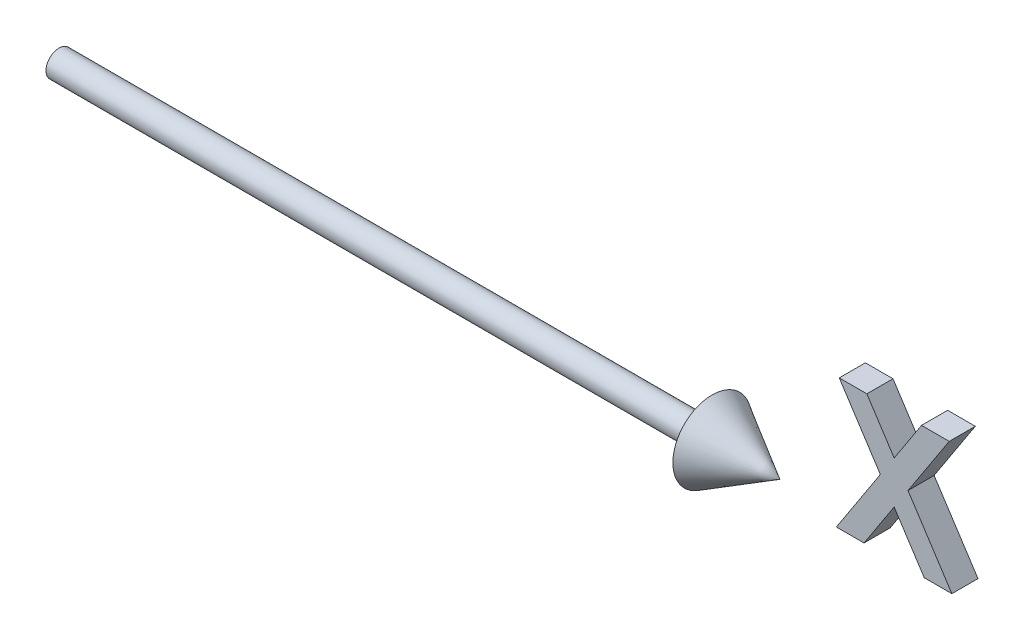
ISO-10303-21;
HEADER;
FILE_DESCRIPTION(('STEP AP214'),'2;1');
FILE_NAME('part.step','',(''),(''),'','','');
FILE_SCHEMA(('AUTOMOTIVE_DESIGN { 1 0 10303 214 1 1 1 1 }'));
ENDSEC;
DATA;
#1=APPLICATION_CONTEXT('core data for automotive mechanical design processes');
#2=APPLICATION_PROTOCOL_DEFINITION('international standard','automotive_design',2000,#1);
#3=PRODUCT_CONTEXT('',#1,'mechanical');
#4=PRODUCT('Part','Part','',(#3));
#5=PRODUCT_RELATED_PRODUCT_CATEGORY('part','',(#4));
#6=PRODUCT_DEFINITION_FORMATION('','',#4);
#7=PRODUCT_DEFINITION_CONTEXT('part definition',#1,'design');
#8=PRODUCT_DEFINITION('design','',#6,#7);
#9=PRODUCT_DEFINITION_SHAPE('','',#8);
#10=(LENGTH_UNIT() NAMED_UNIT(*) SI_UNIT(.MILLI.,.METRE.));
#11=(NAMED_UNIT(*) PLANE_ANGLE_UNIT() SI_UNIT($,.RADIAN.));
#12=(NAMED_UNIT(*) SI_UNIT($,.STERADIAN.) SOLID_ANGLE_UNIT());
#13=UNCERTAINTY_MEASURE_WITH_UNIT(LENGTH_MEASURE(1.E-05),#10,'distance_accuracy_value','');
#14=(GEOMETRIC_REPRESENTATION_CONTEXT(3) GLOBAL_UNCERTAINTY_ASSIGNED_CONTEXT((#13)) GLOBAL_UNIT_ASSIGNED_CONTEXT((#10,
#11,#12)) REPRESENTATION_CONTEXT('',''));
#15=CARTESIAN_POINT('',(0.,0.,0.));
#16=DIRECTION('',(0.,0.,1.));
#17=DIRECTION('',(1.,0.,0.));
#18=AXIS2_PLACEMENT_3D('',#15,#16,#17);
#19=CARTESIAN_POINT('',(63.8860562688604,5.16626602564103,1.));
#20=DIRECTION('',(-0.838038708623522,-0.54561077963015,0.));
#21=DIRECTION('',(0.54561077963015,-0.838038708623522,0.));
#22=AXIS2_PLACEMENT_3D('',#19,#20,#21);
#23=PLANE('',#22);
#24=DIRECTION('',(-0.54561077963015,0.838038708623522,0.));
#25=VECTOR('',#24,1.);
#26=CARTESIAN_POINT('',(63.8860562688604,5.16626602564103,-1.));
#27=LINE('',#26,#25);
#28=CARTESIAN_POINT('',(63.8860562688604,5.16626602564103,-1.));
#29=VERTEX_POINT('',#28);
#30=CARTESIAN_POINT('',(60.7390210124502,10.,-1.));
#31=VERTEX_POINT('',#30);
#32=EDGE_CURVE('E175',#29,#31,#27,.T.);
#33=ORIENTED_EDGE('',*,*,#32,.F.);
#34=DIRECTION('',(0.,0.,-1.));
#35=VECTOR('',#34,1.);
#36=CARTESIAN_POINT('',(63.8860562688604,5.16626602564103,1.));
#37=LINE('',#36,#35);
#38=CARTESIAN_POINT('',(63.8860562688604,5.16626602564103,1.));
#39=VERTEX_POINT('',#38);
#40=EDGE_CURVE('E12',#39,#29,#37,.T.);
#41=ORIENTED_EDGE('',*,*,#40,.F.);
#42=DIRECTION('',(-0.54561077963015,0.838038708623522,0.));
#43=VECTOR('',#42,1.);
#44=CARTESIAN_POINT('',(63.8860562688604,5.16626602564103,1.));
#45=LINE('',#44,#43);
#46=CARTESIAN_POINT('',(60.7390210124502,10.,1.));
#47=VERTEX_POINT('',#46);
#48=EDGE_CURVE('E207',#39,#47,#45,.T.);
#49=ORIENTED_EDGE('',*,*,#48,.T.);
#50=DIRECTION('',(0.,0.,-1.));
#51=VECTOR('',#50,1.);
#52=CARTESIAN_POINT('',(60.7390210124502,10.,1.));
#53=LINE('',#52,#51);
#54=EDGE_CURVE('E57',#47,#31,#53,.T.);
#55=ORIENTED_EDGE('',*,*,#54,.T.);
#56=EDGE_LOOP('',(#33,#41,#49,#55));
#57=FACE_BOUND('',#56,.T.);
#58=ADVANCED_FACE('F54',(#57),#23,.T.);
#59=CARTESIAN_POINT('',(60.5166652432194,0.,1.));
#60=DIRECTION('',(-0.837604135666319,0.546277687549728,0.));
#61=DIRECTION('',(-0.546277687549728,-0.837604135666319,0.));
#62=AXIS2_PLACEMENT_3D('',#59,#60,#61);
#63=PLANE('',#62);
#64=DIRECTION('',(0.546277687549728,0.837604135666319,0.));
#65=VECTOR('',#64,1.);
#66=CARTESIAN_POINT('',(60.5166652432194,0.,-1.));
#67=LINE('',#66,#65);
#68=CARTESIAN_POINT('',(60.5166652432194,0.,-1.));
#69=VERTEX_POINT('',#68);
#70=EDGE_CURVE('E205',#69,#29,#67,.T.);
#71=ORIENTED_EDGE('',*,*,#70,.F.);
#72=DIRECTION('',(0.,0.,-1.));
#73=VECTOR('',#72,1.);
#74=CARTESIAN_POINT('',(60.5166652432194,0.,1.));
#75=LINE('',#74,#73);
#76=CARTESIAN_POINT('',(60.5166652432194,0.,1.));
#77=VERTEX_POINT('',#76);
#78=EDGE_CURVE('E63',#77,#69,#75,.T.);
#79=ORIENTED_EDGE('',*,*,#78,.F.);
#80=DIRECTION('',(0.546277687549728,0.837604135666319,0.));
#81=VECTOR('',#80,1.);
#82=CARTESIAN_POINT('',(60.5166652432194,0.,1.));
#83=LINE('',#82,#81);
#84=EDGE_CURVE('E165',#77,#39,#83,.T.);
#85=ORIENTED_EDGE('',*,*,#84,.T.);
#86=ORIENTED_EDGE('',*,*,#40,.T.);
#87=EDGE_LOOP('',(#71,#79,#85,#86));
#88=FACE_BOUND('',#87,.T.);
#89=ADVANCED_FACE('F227',(#88),#63,.T.);
#90=CARTESIAN_POINT('',(62.6360562688604,0.,1.));
#91=DIRECTION('',(0.,-1.,0.));
#92=DIRECTION('',(0.,0.,-1.));
#93=AXIS2_PLACEMENT_3D('',#90,#91,#92);
#94=PLANE('',#93);
#95=DIRECTION('',(-1.,0.,0.));
#96=VECTOR('',#95,1.);
#97=CARTESIAN_POINT('',(62.6360562688604,0.,-1.));
#98=LINE('',#97,#96);
#99=CARTESIAN_POINT('',(62.6360562688604,0.,-1.));
#100=VERTEX_POINT('',#99);
#101=EDGE_CURVE('E152',#100,#69,#98,.T.);
#102=ORIENTED_EDGE('',*,*,#101,.F.);
#103=DIRECTION('',(0.,0.,-1.));
#104=VECTOR('',#103,1.);
#105=CARTESIAN_POINT('',(62.6360562688604,0.,1.));
#106=LINE('',#105,#104);
#107=CARTESIAN_POINT('',(62.6360562688604,0.,1.));
#108=VERTEX_POINT('',#107);
#109=EDGE_CURVE('E147',#108,#100,#106,.T.);
#110=ORIENTED_EDGE('',*,*,#109,.F.);
#111=DIRECTION('',(-1.,0.,0.));
#112=VECTOR('',#111,1.);
#113=CARTESIAN_POINT('',(62.6360562688604,0.,1.));
#114=LINE('',#113,#112);
#115=EDGE_CURVE('E150',#108,#77,#114,.T.);
#116=ORIENTED_EDGE('',*,*,#115,.T.);
#117=ORIENTED_EDGE('',*,*,#78,.T.);
#118=EDGE_LOOP('',(#102,#110,#116,#117));
#119=FACE_BOUND('',#118,.T.);
#120=ADVANCED_FACE('F149',(#119),#94,.T.);
#121=CARTESIAN_POINT('',(64.9437485765527,3.53966346153846,1.));
#122=DIRECTION('',(0.837695468030143,-0.546137622620672,0.));
#123=DIRECTION('',(0.546137622620672,0.837695468030143,0.));
#124=AXIS2_PLACEMENT_3D('',#121,#122,#123);
#125=PLANE('',#124);
#126=DIRECTION('',(-0.546137622620672,-0.837695468030143,0.));
#127=VECTOR('',#126,1.);
#128=CARTESIAN_POINT('',(64.9437485765527,3.53966346153846,-1.));
#129=LINE('',#128,#127);
#130=CARTESIAN_POINT('',(64.9437485765527,3.53966346153846,-1.));
#131=VERTEX_POINT('',#130);
#132=EDGE_CURVE('E202',#131,#100,#129,.T.);
#133=ORIENTED_EDGE('',*,*,#132,.F.);
#134=DIRECTION('',(0.,0.,-1.));
#135=VECTOR('',#134,1.);
#136=CARTESIAN_POINT('',(64.9437485765527,3.53966346153846,1.));
#137=LINE('',#136,#135);
#138=CARTESIAN_POINT('',(64.9437485765527,3.53966346153846,1.));
#139=VERTEX_POINT('',#138);
#140=EDGE_CURVE('E157',#139,#131,#137,.T.);
#141=ORIENTED_EDGE('',*,*,#140,.F.);
#142=DIRECTION('',(-0.546137622620672,-0.837695468030143,0.));
#143=VECTOR('',#142,1.);
#144=CARTESIAN_POINT('',(64.9437485765527,3.53966346153846,1.));
#145=LINE('',#144,#143);
#146=EDGE_CURVE('E163',#139,#108,#145,.T.);
#147=ORIENTED_EDGE('',*,*,#146,.T.);
#148=ORIENTED_EDGE('',*,*,#109,.T.);
#149=EDGE_LOOP('',(#133,#141,#147,#148));
#150=FACE_BOUND('',#149,.T.);
#151=ADVANCED_FACE('F167',(#150),#125,.T.);
#152=CARTESIAN_POINT('',(67.2474344739886,0.,1.));
#153=DIRECTION('',(-0.838129206473897,-0.545471752939999,0.));
#154=DIRECTION('',(0.545471752939999,-0.838129206473897,0.));
#155=AXIS2_PLACEMENT_3D('',#152,#153,#154);
#156=PLANE('',#155);
#157=DIRECTION('',(-0.545471752939999,0.838129206473897,0.));
#158=VECTOR('',#157,1.);
#159=CARTESIAN_POINT('',(67.2474344739886,0.,-1.));
#160=LINE('',#159,#158);
#161=CARTESIAN_POINT('',(67.2474344739886,0.,-1.));
#162=VERTEX_POINT('',#161);
#163=EDGE_CURVE('E199',#162,#131,#160,.T.);
#164=ORIENTED_EDGE('',*,*,#163,.F.);
#165=DIRECTION('',(0.,0.,-1.));
#166=VECTOR('',#165,1.);
#167=CARTESIAN_POINT('',(67.2474344739886,0.,1.));
#168=LINE('',#167,#166);
#169=CARTESIAN_POINT('',(67.2474344739886,0.,1.));
#170=VERTEX_POINT('',#169);
#171=EDGE_CURVE('E211',#170,#162,#168,.T.);
#172=ORIENTED_EDGE('',*,*,#171,.F.);
#173=DIRECTION('',(-0.545471752939999,0.838129206473897,0.));
#174=VECTOR('',#173,1.);
#175=CARTESIAN_POINT('',(67.2474344739886,0.,1.));
#176=LINE('',#175,#174);
#177=EDGE_CURVE('E168',#170,#139,#176,.T.);
#178=ORIENTED_EDGE('',*,*,#177,.T.);
#179=ORIENTED_EDGE('',*,*,#140,.T.);
#180=EDGE_LOOP('',(#164,#172,#178,#179));
#181=FACE_BOUND('',#180,.T.);
#182=ADVANCED_FACE('F240',(#181),#156,.T.);
#183=CARTESIAN_POINT('',(69.3628190893732,0.,1.));
#184=DIRECTION('',(0.,-1.,0.));
#185=DIRECTION('',(0.,0.,-1.));
#186=AXIS2_PLACEMENT_3D('',#183,#184,#185);
#187=PLANE('',#186);
#188=DIRECTION('',(-1.,0.,0.));
#189=VECTOR('',#188,1.);
#190=CARTESIAN_POINT('',(69.3628190893732,0.,-1.));
#191=LINE('',#190,#189);
#192=CARTESIAN_POINT('',(69.3628190893732,0.,-1.));
#193=VERTEX_POINT('',#192);
#194=EDGE_CURVE('E196',#193,#162,#191,.T.);
#195=ORIENTED_EDGE('',*,*,#194,.F.);
#196=DIRECTION('',(0.,0.,-1.));
#197=VECTOR('',#196,1.);
#198=CARTESIAN_POINT('',(69.3628190893732,0.,1.));
#199=LINE('',#198,#197);
#200=CARTESIAN_POINT('',(69.3628190893732,0.,1.));
#201=VERTEX_POINT('',#200);
#202=EDGE_CURVE('E213',#201,#193,#199,.T.);
#203=ORIENTED_EDGE('',*,*,#202,.F.);
#204=DIRECTION('',(-1.,0.,0.));
#205=VECTOR('',#204,1.);
#206=CARTESIAN_POINT('',(69.3628190893732,0.,1.));
#207=LINE('',#206,#205);
#208=EDGE_CURVE('E170',#201,#170,#207,.T.);
#209=ORIENTED_EDGE('',*,*,#208,.T.);
#210=ORIENTED_EDGE('',*,*,#171,.T.);
#211=EDGE_LOOP('',(#195,#203,#209,#210));
#212=FACE_BOUND('',#211,.T.);
#213=ADVANCED_FACE('F243',(#212),#187,.T.);
#214=CARTESIAN_POINT('',(66.0034440893732,5.16225961538462,1.));
#215=DIRECTION('',(0.838153693381687,0.545434126426499,0.));
#216=DIRECTION('',(-0.545434126426499,0.838153693381687,0.));
#217=AXIS2_PLACEMENT_3D('',#214,#215,#216);
#218=PLANE('',#217);
#219=DIRECTION('',(0.545434126426499,-0.838153693381687,0.));
#220=VECTOR('',#219,1.);
#221=CARTESIAN_POINT('',(66.0034440893732,5.16225961538462,-1.));
#222=LINE('',#221,#220);
#223=CARTESIAN_POINT('',(66.0034440893732,5.16225961538462,-1.));
#224=VERTEX_POINT('',#223);
#225=EDGE_CURVE('E193',#224,#193,#222,.T.);
#226=ORIENTED_EDGE('',*,*,#225,.F.);
#227=DIRECTION('',(0.,0.,-1.));
#228=VECTOR('',#227,1.);
#229=CARTESIAN_POINT('',(66.0034440893732,5.16225961538462,1.));
#230=LINE('',#229,#228);
#231=CARTESIAN_POINT('',(66.0034440893732,5.16225961538462,1.));
#232=VERTEX_POINT('',#231);
#233=EDGE_CURVE('E215',#232,#224,#230,.T.);
#234=ORIENTED_EDGE('',*,*,#233,.F.);
#235=DIRECTION('',(0.545434126426499,-0.838153693381687,0.));
#236=VECTOR('',#235,1.);
#237=CARTESIAN_POINT('',(66.0034440893732,5.16225961538462,1.));
#238=LINE('',#237,#236);
#239=EDGE_CURVE('E397',#232,#201,#238,.T.);
#240=ORIENTED_EDGE('',*,*,#239,.T.);
#241=ORIENTED_EDGE('',*,*,#202,.T.);
#242=EDGE_LOOP('',(#226,#234,#240,#241));
#243=FACE_BOUND('',#242,.T.);
#244=ADVANCED_FACE('F247',(#243),#218,.T.);
#245=CARTESIAN_POINT('',(69.1584921662963,10.,1.));
#246=DIRECTION('',(0.837610596838615,-0.546267780546922,0.));
#247=DIRECTION('',(0.546267780546922,0.837610596838615,0.));
#248=AXIS2_PLACEMENT_3D('',#245,#246,#247);
#249=PLANE('',#248);
#250=DIRECTION('',(-0.546267780546922,-0.837610596838614,0.));
#251=VECTOR('',#250,1.);
#252=CARTESIAN_POINT('',(69.1584921662963,10.,-1.));
#253=LINE('',#252,#251);
#254=CARTESIAN_POINT('',(69.1584921662963,10.,-1.));
#255=VERTEX_POINT('',#254);
#256=EDGE_CURVE('E190',#255,#224,#253,.T.);
#257=ORIENTED_EDGE('',*,*,#256,.F.);
#258=DIRECTION('',(0.,0.,-1.));
#259=VECTOR('',#258,1.);
#260=CARTESIAN_POINT('',(69.1584921662963,10.,1.));
#261=LINE('',#260,#259);
#262=CARTESIAN_POINT('',(69.1584921662963,10.,1.));
#263=VERTEX_POINT('',#262);
#264=EDGE_CURVE('E217',#263,#255,#261,.T.);
#265=ORIENTED_EDGE('',*,*,#264,.F.);
#266=DIRECTION('',(-0.546267780546922,-0.837610596838614,0.));
#267=VECTOR('',#266,1.);
#268=CARTESIAN_POINT('',(69.1584921662963,10.,1.));
#269=LINE('',#268,#267);
#270=EDGE_CURVE('E401',#263,#232,#269,.T.);
#271=ORIENTED_EDGE('',*,*,#270,.T.);
#272=ORIENTED_EDGE('',*,*,#233,.T.);
#273=EDGE_LOOP('',(#257,#265,#271,#272));
#274=FACE_BOUND('',#273,.T.);
#275=ADVANCED_FACE('F251',(#274),#249,.T.);
#276=CARTESIAN_POINT('',(67.0370979355271,10.,1.));
#277=DIRECTION('',(0.,1.,0.));
#278=DIRECTION('',(0.,0.,1.));
#279=AXIS2_PLACEMENT_3D('',#276,#277,#278);
#280=PLANE('',#279);
#281=DIRECTION('',(1.,0.,0.));
#282=VECTOR('',#281,1.);
#283=CARTESIAN_POINT('',(67.0370979355271,10.,-1.));
#284=LINE('',#283,#282);
#285=CARTESIAN_POINT('',(67.0370979355271,10.,-1.));
#286=VERTEX_POINT('',#285);
#287=EDGE_CURVE('E187',#286,#255,#284,.T.);
#288=ORIENTED_EDGE('',*,*,#287,.F.);
#289=DIRECTION('',(0.,0.,-1.));
#290=VECTOR('',#289,1.);
#291=CARTESIAN_POINT('',(67.0370979355271,10.,1.));
#292=LINE('',#291,#290);
#293=CARTESIAN_POINT('',(67.0370979355271,10.,1.));
#294=VERTEX_POINT('',#293);
#295=EDGE_CURVE('E219',#294,#286,#292,.T.);
#296=ORIENTED_EDGE('',*,*,#295,.F.);
#297=DIRECTION('',(1.,0.,0.));
#298=VECTOR('',#297,1.);
#299=CARTESIAN_POINT('',(67.0370979355271,10.,1.));
#300=LINE('',#299,#298);
#301=EDGE_CURVE('E390',#294,#263,#300,.T.);
#302=ORIENTED_EDGE('',*,*,#301,.T.);
#303=ORIENTED_EDGE('',*,*,#264,.T.);
#304=EDGE_LOOP('',(#288,#296,#302,#303));
#305=FACE_BOUND('',#304,.T.);
#306=ADVANCED_FACE('F255',(#305),#280,.T.);
#307=CARTESIAN_POINT('',(64.9437485765527,6.78886217948718,1.));
#308=DIRECTION('',(-0.83771454554161,0.54610835938302,0.));
#309=DIRECTION('',(-0.54610835938302,-0.83771454554161,0.));
#310=AXIS2_PLACEMENT_3D('',#307,#308,#309);
#311=PLANE('',#310);
#312=DIRECTION('',(0.54610835938302,0.83771454554161,0.));
#313=VECTOR('',#312,1.);
#314=CARTESIAN_POINT('',(64.9437485765527,6.78886217948718,-1.));
#315=LINE('',#314,#313);
#316=CARTESIAN_POINT('',(64.9437485765527,6.78886217948718,-1.));
#317=VERTEX_POINT('',#316);
#318=EDGE_CURVE('E184',#317,#286,#315,.T.);
#319=ORIENTED_EDGE('',*,*,#318,.F.);
#320=DIRECTION('',(0.,0.,-1.));
#321=VECTOR('',#320,1.);
#322=CARTESIAN_POINT('',(64.9437485765527,6.78886217948718,1.));
#323=LINE('',#322,#321);
#324=CARTESIAN_POINT('',(64.9437485765527,6.78886217948718,1.));
#325=VERTEX_POINT('',#324);
#326=EDGE_CURVE('E221',#325,#317,#323,.T.);
#327=ORIENTED_EDGE('',*,*,#326,.F.);
#328=DIRECTION('',(0.54610835938302,0.83771454554161,0.));
#329=VECTOR('',#328,1.);
#330=CARTESIAN_POINT('',(64.9437485765527,6.78886217948718,1.));
#331=LINE('',#330,#329);
#332=EDGE_CURVE('E386',#325,#294,#331,.T.);
#333=ORIENTED_EDGE('',*,*,#332,.T.);
#334=ORIENTED_EDGE('',*,*,#295,.T.);
#335=EDGE_LOOP('',(#319,#327,#333,#334));
#336=FACE_BOUND('',#335,.T.);
#337=ADVANCED_FACE('F259',(#336),#311,.T.);
#338=CARTESIAN_POINT('',(62.8544056278348,10.,1.));
#339=DIRECTION('',(0.838192650545647,0.54537425734193,0.));
#340=DIRECTION('',(-0.54537425734193,0.838192650545647,0.));
#341=AXIS2_PLACEMENT_3D('',#338,#339,#340);
#342=PLANE('',#341);
#343=DIRECTION('',(0.54537425734193,-0.838192650545647,0.));
#344=VECTOR('',#343,1.);
#345=CARTESIAN_POINT('',(62.8544056278348,10.,-1.));
#346=LINE('',#345,#344);
#347=CARTESIAN_POINT('',(62.8544056278348,10.,-1.));
#348=VERTEX_POINT('',#347);
#349=EDGE_CURVE('E181',#348,#317,#346,.T.);
#350=ORIENTED_EDGE('',*,*,#349,.F.);
#351=DIRECTION('',(0.,0.,-1.));
#352=VECTOR('',#351,1.);
#353=CARTESIAN_POINT('',(62.8544056278348,10.,1.));
#354=LINE('',#353,#352);
#355=CARTESIAN_POINT('',(62.8544056278348,10.,1.));
#356=VERTEX_POINT('',#355);
#357=EDGE_CURVE('E222',#356,#348,#354,.T.);
#358=ORIENTED_EDGE('',*,*,#357,.F.);
#359=DIRECTION('',(0.54537425734193,-0.838192650545647,0.));
#360=VECTOR('',#359,1.);
#361=CARTESIAN_POINT('',(62.8544056278348,10.,1.));
#362=LINE('',#361,#360);
#363=EDGE_CURVE('E407',#356,#325,#362,.T.);
#364=ORIENTED_EDGE('',*,*,#363,.T.);
#365=ORIENTED_EDGE('',*,*,#326,.T.);
#366=EDGE_LOOP('',(#350,#358,#364,#365));
#367=FACE_BOUND('',#366,.T.);
#368=ADVANCED_FACE('F263',(#367),#342,.T.);
#369=CARTESIAN_POINT('',(60.7390210124502,10.,1.));
#370=DIRECTION('',(0.,1.,0.));
#371=DIRECTION('',(0.,0.,1.));
#372=AXIS2_PLACEMENT_3D('',#369,#370,#371);
#373=PLANE('',#372);
#374=DIRECTION('',(1.,0.,0.));
#375=VECTOR('',#374,1.);
#376=CARTESIAN_POINT('',(60.7390210124502,10.,-1.));
#377=LINE('',#376,#375);
#378=EDGE_CURVE('E178',#31,#348,#377,.T.);
#379=ORIENTED_EDGE('',*,*,#378,.F.);
#380=ORIENTED_EDGE('',*,*,#54,.F.);
#381=DIRECTION('',(1.,0.,0.));
#382=VECTOR('',#381,1.);
#383=CARTESIAN_POINT('',(60.7390210124502,10.,1.));
#384=LINE('',#383,#382);
#385=EDGE_CURVE('E409',#47,#356,#384,.T.);
#386=ORIENTED_EDGE('',*,*,#385,.T.);
#387=ORIENTED_EDGE('',*,*,#357,.T.);
#388=EDGE_LOOP('',(#379,#380,#386,#387));
#389=FACE_BOUND('',#388,.T.);
#390=ADVANCED_FACE('F224',(#389),#373,.T.);
#391=CARTESIAN_POINT('',(0.,0.,1.));
#392=DIRECTION('',(0.,0.,-1.));
#393=DIRECTION('',(-1.,0.,0.));
#394=AXIS2_PLACEMENT_3D('',#391,#392,#393);
#395=PLANE('',#394);
#396=ORIENTED_EDGE('',*,*,#48,.F.);
#397=ORIENTED_EDGE('',*,*,#84,.F.);
#398=ORIENTED_EDGE('',*,*,#115,.F.);
#399=ORIENTED_EDGE('',*,*,#146,.F.);
#400=ORIENTED_EDGE('',*,*,#177,.F.);
#401=ORIENTED_EDGE('',*,*,#208,.F.);
#402=ORIENTED_EDGE('',*,*,#239,.F.);
#403=ORIENTED_EDGE('',*,*,#270,.F.);
#404=ORIENTED_EDGE('',*,*,#301,.F.);
#405=ORIENTED_EDGE('',*,*,#332,.F.);
#406=ORIENTED_EDGE('',*,*,#363,.F.);
#407=ORIENTED_EDGE('',*,*,#385,.F.);
#408=EDGE_LOOP('',(#396,#397,#398,#399,#400,#401,#402,#403,#404,#405,#406,#407));
#409=FACE_BOUND('',#408,.T.);
#410=ADVANCED_FACE('F161',(#409),#395,.F.);
#411=CARTESIAN_POINT('',(0.,0.,-1.));
#412=DIRECTION('',(0.,0.,-1.));
#413=DIRECTION('',(-1.,0.,0.));
#414=AXIS2_PLACEMENT_3D('',#411,#412,#413);
#415=PLANE('',#414);
#416=ORIENTED_EDGE('',*,*,#32,.T.);
#417=ORIENTED_EDGE('',*,*,#378,.T.);
#418=ORIENTED_EDGE('',*,*,#349,.T.);
#419=ORIENTED_EDGE('',*,*,#318,.T.);
#420=ORIENTED_EDGE('',*,*,#287,.T.);
#421=ORIENTED_EDGE('',*,*,#256,.T.);
#422=ORIENTED_EDGE('',*,*,#225,.T.);
#423=ORIENTED_EDGE('',*,*,#194,.T.);
#424=ORIENTED_EDGE('',*,*,#163,.T.);
#425=ORIENTED_EDGE('',*,*,#132,.T.);
#426=ORIENTED_EDGE('',*,*,#101,.T.);
#427=ORIENTED_EDGE('',*,*,#70,.T.);
#428=EDGE_LOOP('',(#416,#417,#418,#419,#420,#421,#422,#423,#424,#425,#426,#427));
#429=FACE_BOUND('',#428,.T.);
#430=ADVANCED_FACE('F226',(#429),#415,.T.);
#431=CLOSED_SHELL('',(#58,#89,#120,#151,#182,#213,#244,#275,#306,#337,#368,#390,#410,#430));
#432=MANIFOLD_SOLID_BREP('B2',#431);
#433=CARTESIAN_POINT('',(50.,0.,0.));
#434=DIRECTION('',(-1.,0.,0.));
#435=DIRECTION('',(0.,0.,1.));
#436=AXIS2_PLACEMENT_3D('',#433,#434,#435);
#437=CONICAL_SURFACE('',#436,3.,0.523598775598304);
#438=CARTESIAN_POINT('',(55.1961524227066,0.,0.));
#439=VERTEX_POINT('',#438);
#440=VERTEX_LOOP('',#439);
#441=FACE_BOUND('',#440,.T.);
#442=CARTESIAN_POINT('',(50.,0.,0.));
#443=DIRECTION('',(1.,0.,0.));
#444=DIRECTION('',(0.,0.,-1.));
#445=AXIS2_PLACEMENT_3D('',#442,#443,#444);
#446=CIRCLE('',#445,3.);
#447=CARTESIAN_POINT('',(50.,0.,-3.));
#448=VERTEX_POINT('',#447);
#449=EDGE_CURVE('E52',#448,#448,#446,.T.);
#450=ORIENTED_EDGE('',*,*,#449,.T.);
#451=EDGE_LOOP('',(#450));
#452=FACE_BOUND('',#451,.T.);
#453=ADVANCED_FACE('F421',(#441,#452),#437,.T.);
#454=CARTESIAN_POINT('',(50.,0.,0.));
#455=DIRECTION('',(1.,0.,0.));
#456=DIRECTION('',(0.,0.,-1.));
#457=AXIS2_PLACEMENT_3D('',#454,#455,#456);
#458=PLANE('',#457);
#459=ORIENTED_EDGE('',*,*,#449,.F.);
#460=EDGE_LOOP('',(#459));
#461=FACE_BOUND('',#460,.T.);
#462=ADVANCED_FACE('F430',(#461),#458,.F.);
#463=CLOSED_SHELL('',(#453,#462));
#464=MANIFOLD_SOLID_BREP('B6',#463);
#465=CARTESIAN_POINT('',(50.,0.,0.));
#466=DIRECTION('',(-1.,0.,0.));
#467=DIRECTION('',(0.,0.,1.));
#468=AXIS2_PLACEMENT_3D('',#465,#466,#467);
#469=CYLINDRICAL_SURFACE('',#468,1.);
#470=CARTESIAN_POINT('',(50.,0.,0.));
#471=DIRECTION('',(1.,0.,0.));
#472=DIRECTION('',(0.,0.,-1.));
#473=AXIS2_PLACEMENT_3D('',#470,#471,#472);
#474=CIRCLE('',#473,1.);
#475=CARTESIAN_POINT('',(50.,0.,-1.));
#476=VERTEX_POINT('',#475);
#477=EDGE_CURVE('E420',#476,#476,#474,.T.);
#478=ORIENTED_EDGE('',*,*,#477,.F.);
#479=EDGE_LOOP('',(#478));
#480=FACE_BOUND('',#479,.T.);
#481=CARTESIAN_POINT('',(0.,0.,0.));
#482=DIRECTION('',(1.,0.,0.));
#483=DIRECTION('',(0.,0.,-1.));
#484=AXIS2_PLACEMENT_3D('',#481,#482,#483);
#485=CIRCLE('',#484,1.);
#486=CARTESIAN_POINT('',(0.,0.,-1.));
#487=VERTEX_POINT('',#486);
#488=EDGE_CURVE('E456',#487,#487,#485,.T.);
#489=ORIENTED_EDGE('',*,*,#488,.T.);
#490=EDGE_LOOP('',(#489));
#491=FACE_BOUND('',#490,.T.);
#492=ADVANCED_FACE('F453',(#480,#491),#469,.T.);
#493=CARTESIAN_POINT('',(50.,0.,0.));
#494=DIRECTION('',(1.,0.,0.));
#495=DIRECTION('',(0.,0.,-1.));
#496=AXIS2_PLACEMENT_3D('',#493,#494,#495);
#497=PLANE('',#496);
#498=ORIENTED_EDGE('',*,*,#477,.T.);
#499=EDGE_LOOP('',(#498));
#500=FACE_BOUND('',#499,.T.);
#501=ADVANCED_FACE('F470',(#500),#497,.T.);
#502=CARTESIAN_POINT('',(0.,0.,0.));
#503=DIRECTION('',(1.,0.,0.));
#504=DIRECTION('',(0.,0.,-1.));
#505=AXIS2_PLACEMENT_3D('',#502,#503,#504);
#506=PLANE('',#505);
#507=ORIENTED_EDGE('',*,*,#488,.F.);
#508=EDGE_LOOP('',(#507));
#509=FACE_BOUND('',#508,.T.);
#510=ADVANCED_FACE('F468',(#509),#506,.F.);
#511=CLOSED_SHELL('',(#492,#501,#510));
#512=MANIFOLD_SOLID_BREP('B46',#511);
#513=ADVANCED_BREP_SHAPE_REPRESENTATION('',(#18,#432,#464,#512),#14);
#514=SHAPE_DEFINITION_REPRESENTATION(#9,#513);
ENDSEC;
END-ISO-10303-21;
